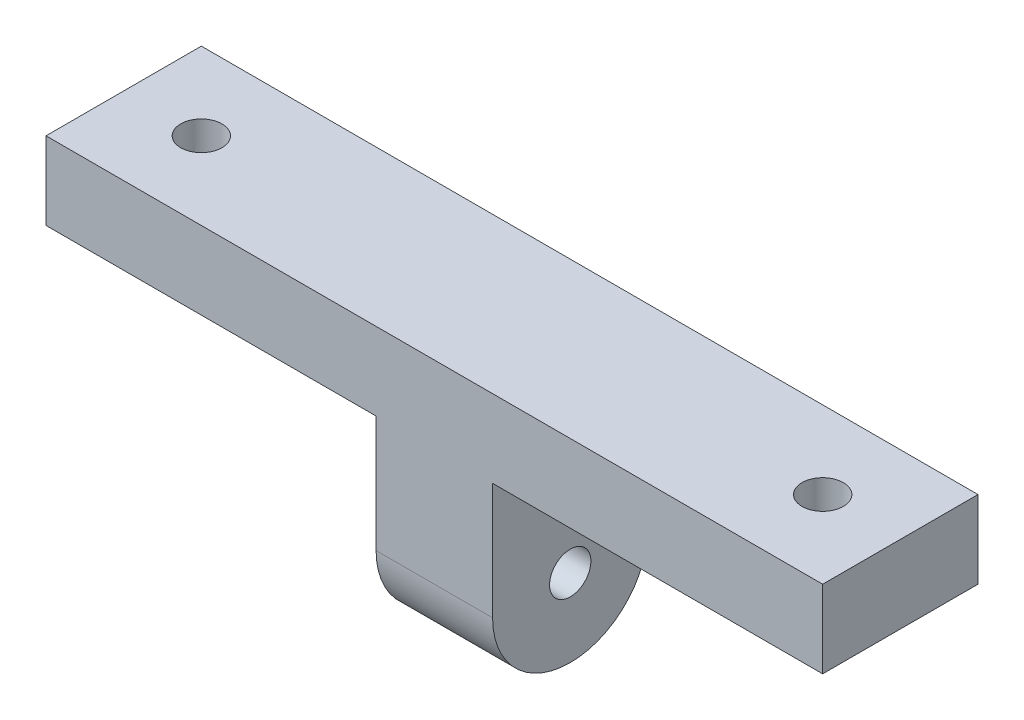
ISO-10303-21;
HEADER;
FILE_DESCRIPTION(('STEP AP214'),'2;1');
FILE_NAME('part.step','',(''),(''),'','','');
FILE_SCHEMA(('AUTOMOTIVE_DESIGN { 1 0 10303 214 1 1 1 1 }'));
ENDSEC;
DATA;
#1=APPLICATION_CONTEXT('core data for automotive mechanical design processes');
#2=APPLICATION_PROTOCOL_DEFINITION('international standard','automotive_design',2000,#1);
#3=PRODUCT_CONTEXT('',#1,'mechanical');
#4=PRODUCT('Part','Part','',(#3));
#5=PRODUCT_RELATED_PRODUCT_CATEGORY('part','',(#4));
#6=PRODUCT_DEFINITION_FORMATION('','',#4);
#7=PRODUCT_DEFINITION_CONTEXT('part definition',#1,'design');
#8=PRODUCT_DEFINITION('design','',#6,#7);
#9=PRODUCT_DEFINITION_SHAPE('','',#8);
#10=(LENGTH_UNIT() NAMED_UNIT(*) SI_UNIT(.MILLI.,.METRE.));
#11=(NAMED_UNIT(*) PLANE_ANGLE_UNIT() SI_UNIT($,.RADIAN.));
#12=(NAMED_UNIT(*) SI_UNIT($,.STERADIAN.) SOLID_ANGLE_UNIT());
#13=UNCERTAINTY_MEASURE_WITH_UNIT(LENGTH_MEASURE(1.E-05),#10,'distance_accuracy_value','');
#14=(GEOMETRIC_REPRESENTATION_CONTEXT(3) GLOBAL_UNCERTAINTY_ASSIGNED_CONTEXT((#13)) GLOBAL_UNIT_ASSIGNED_CONTEXT((#10,
#11,#12)) REPRESENTATION_CONTEXT('',''));
#15=CARTESIAN_POINT('',(0.,0.,0.));
#16=DIRECTION('',(0.,0.,1.));
#17=DIRECTION('',(1.,0.,0.));
#18=AXIS2_PLACEMENT_3D('',#15,#16,#17);
#19=CARTESIAN_POINT('',(0.,0.,0.));
#20=DIRECTION('',(0.,1.,0.));
#21=DIRECTION('',(0.,0.,1.));
#22=AXIS2_PLACEMENT_3D('',#19,#20,#21);
#23=PLANE('',#22);
#24=CARTESIAN_POINT('',(50.8,0.,0.));
#25=DIRECTION('',(0.,1.,0.));
#26=DIRECTION('',(0.,0.,1.));
#27=AXIS2_PLACEMENT_3D('',#24,#25,#26);
#28=CIRCLE('',#27,3.3782);
#29=CARTESIAN_POINT('',(50.8,0.,3.3782));
#30=VERTEX_POINT('',#29);
#31=EDGE_CURVE('E152',#30,#30,#28,.T.);
#32=ORIENTED_EDGE('',*,*,#31,.T.);
#33=EDGE_LOOP('',(#32));
#34=FACE_BOUND('',#33,.T.);
#35=DIRECTION('',(0.,0.,1.));
#36=VECTOR('',#35,1.);
#37=CARTESIAN_POINT('',(9.52500000000001,0.,0.));
#38=LINE('',#37,#36);
#39=CARTESIAN_POINT('',(9.52500000000001,0.,-12.7));
#40=VERTEX_POINT('',#39);
#41=CARTESIAN_POINT('',(9.52500000000001,0.,12.7));
#42=VERTEX_POINT('',#41);
#43=EDGE_CURVE('E114',#40,#42,#38,.T.);
#44=ORIENTED_EDGE('',*,*,#43,.F.);
#45=DIRECTION('',(1.,0.,0.));
#46=VECTOR('',#45,1.);
#47=CARTESIAN_POINT('',(0.,0.,-12.7));
#48=LINE('',#47,#46);
#49=CARTESIAN_POINT('',(63.5,0.,-12.7));
#50=VERTEX_POINT('',#49);
#51=EDGE_CURVE('E128',#40,#50,#48,.T.);
#52=ORIENTED_EDGE('',*,*,#51,.T.);
#53=DIRECTION('',(0.,0.,1.));
#54=VECTOR('',#53,1.);
#55=CARTESIAN_POINT('',(63.5,0.,0.));
#56=LINE('',#55,#54);
#57=CARTESIAN_POINT('',(63.5,0.,12.7));
#58=VERTEX_POINT('',#57);
#59=EDGE_CURVE('E140',#50,#58,#56,.T.);
#60=ORIENTED_EDGE('',*,*,#59,.T.);
#61=DIRECTION('',(1.,0.,0.));
#62=VECTOR('',#61,1.);
#63=CARTESIAN_POINT('',(0.,0.,12.7));
#64=LINE('',#63,#62);
#65=EDGE_CURVE('E130',#42,#58,#64,.T.);
#66=ORIENTED_EDGE('',*,*,#65,.F.);
#67=EDGE_LOOP('',(#44,#52,#60,#66));
#68=FACE_BOUND('',#67,.T.);
#69=ADVANCED_FACE('F41',(#34,#68),#23,.F.);
#70=CARTESIAN_POINT('',(0.,12.7,12.7));
#71=DIRECTION('',(0.,0.,-1.));
#72=DIRECTION('',(-1.,0.,0.));
#73=AXIS2_PLACEMENT_3D('',#70,#71,#72);
#74=PLANE('',#73);
#75=DIRECTION('',(0.,1.,0.));
#76=VECTOR('',#75,1.);
#77=CARTESIAN_POINT('',(-9.525,-31.75,12.7));
#78=LINE('',#77,#76);
#79=CARTESIAN_POINT('',(-9.525,-19.05,12.7));
#80=VERTEX_POINT('',#79);
#81=CARTESIAN_POINT('',(-9.525,0.,12.7));
#82=VERTEX_POINT('',#81);
#83=EDGE_CURVE('E240',#80,#82,#78,.T.);
#84=ORIENTED_EDGE('',*,*,#83,.F.);
#85=DIRECTION('',(1.,0.,0.));
#86=VECTOR('',#85,1.);
#87=CARTESIAN_POINT('',(0.,-19.05,12.7));
#88=LINE('',#87,#86);
#89=CARTESIAN_POINT('',(9.52500000000001,-19.05,12.7));
#90=VERTEX_POINT('',#89);
#91=EDGE_CURVE('E11',#80,#90,#88,.T.);
#92=ORIENTED_EDGE('',*,*,#91,.T.);
#93=DIRECTION('',(0.,1.,0.));
#94=VECTOR('',#93,1.);
#95=CARTESIAN_POINT('',(9.52500000000001,-31.75,12.7));
#96=LINE('',#95,#94);
#97=EDGE_CURVE('E208',#90,#42,#96,.T.);
#98=ORIENTED_EDGE('',*,*,#97,.T.);
#99=ORIENTED_EDGE('',*,*,#65,.T.);
#100=DIRECTION('',(0.,-1.,0.));
#101=VECTOR('',#100,1.);
#102=CARTESIAN_POINT('',(63.5,12.7,12.7));
#103=LINE('',#102,#101);
#104=CARTESIAN_POINT('',(63.5,12.7,12.7));
#105=VERTEX_POINT('',#104);
#106=EDGE_CURVE('E167',#105,#58,#103,.T.);
#107=ORIENTED_EDGE('',*,*,#106,.F.);
#108=DIRECTION('',(1.,0.,0.));
#109=VECTOR('',#108,1.);
#110=CARTESIAN_POINT('',(0.,12.7,12.7));
#111=LINE('',#110,#109);
#112=CARTESIAN_POINT('',(-63.5,12.7,12.7));
#113=VERTEX_POINT('',#112);
#114=EDGE_CURVE('E195',#113,#105,#111,.T.);
#115=ORIENTED_EDGE('',*,*,#114,.F.);
#116=DIRECTION('',(0.,-1.,0.));
#117=VECTOR('',#116,1.);
#118=CARTESIAN_POINT('',(-63.5,12.7,12.7));
#119=LINE('',#118,#117);
#120=CARTESIAN_POINT('',(-63.5,0.,12.7));
#121=VERTEX_POINT('',#120);
#122=EDGE_CURVE('E157',#113,#121,#119,.T.);
#123=ORIENTED_EDGE('',*,*,#122,.T.);
#124=EDGE_CURVE('E146',#121,#82,#64,.T.);
#125=ORIENTED_EDGE('',*,*,#124,.T.);
#126=EDGE_LOOP('',(#84,#92,#98,#99,#107,#115,#123,#125));
#127=FACE_BOUND('',#126,.T.);
#128=ADVANCED_FACE('F215',(#127),#74,.F.);
#129=CARTESIAN_POINT('',(63.5,12.7,0.));
#130=DIRECTION('',(1.,0.,0.));
#131=DIRECTION('',(0.,0.,-1.));
#132=AXIS2_PLACEMENT_3D('',#129,#130,#131);
#133=PLANE('',#132);
#134=ORIENTED_EDGE('',*,*,#59,.F.);
#135=DIRECTION('',(0.,-1.,0.));
#136=VECTOR('',#135,1.);
#137=CARTESIAN_POINT('',(63.5,12.7,-12.7));
#138=LINE('',#137,#136);
#139=CARTESIAN_POINT('',(63.5,12.7,-12.7));
#140=VERTEX_POINT('',#139);
#141=EDGE_CURVE('E136',#140,#50,#138,.T.);
#142=ORIENTED_EDGE('',*,*,#141,.F.);
#143=DIRECTION('',(0.,0.,1.));
#144=VECTOR('',#143,1.);
#145=CARTESIAN_POINT('',(63.5,12.7,0.));
#146=LINE('',#145,#144);
#147=EDGE_CURVE('E191',#140,#105,#146,.T.);
#148=ORIENTED_EDGE('',*,*,#147,.T.);
#149=ORIENTED_EDGE('',*,*,#106,.T.);
#150=EDGE_LOOP('',(#134,#142,#148,#149));
#151=FACE_BOUND('',#150,.T.);
#152=ADVANCED_FACE('F218',(#151),#133,.T.);
#153=CARTESIAN_POINT('',(0.,12.7,-12.7));
#154=DIRECTION('',(0.,0.,-1.));
#155=DIRECTION('',(-1.,0.,0.));
#156=AXIS2_PLACEMENT_3D('',#153,#154,#155);
#157=PLANE('',#156);
#158=DIRECTION('',(0.,1.,0.));
#159=VECTOR('',#158,1.);
#160=CARTESIAN_POINT('',(9.52500000000001,-31.75,-12.7));
#161=LINE('',#160,#159);
#162=CARTESIAN_POINT('',(9.52500000000001,-19.05,-12.7));
#163=VERTEX_POINT('',#162);
#164=EDGE_CURVE('E110',#163,#40,#161,.T.);
#165=ORIENTED_EDGE('',*,*,#164,.F.);
#166=DIRECTION('',(1.,0.,0.));
#167=VECTOR('',#166,1.);
#168=CARTESIAN_POINT('',(-9.525,-19.05,-12.7));
#169=LINE('',#168,#167);
#170=CARTESIAN_POINT('',(-9.525,-19.05,-12.7));
#171=VERTEX_POINT('',#170);
#172=EDGE_CURVE('E176',#163,#171,#169,.F.);
#173=ORIENTED_EDGE('',*,*,#172,.T.);
#174=DIRECTION('',(0.,1.,0.));
#175=VECTOR('',#174,1.);
#176=CARTESIAN_POINT('',(-9.525,-31.75,-12.7));
#177=LINE('',#176,#175);
#178=CARTESIAN_POINT('',(-9.525,0.,-12.7));
#179=VERTEX_POINT('',#178);
#180=EDGE_CURVE('E123',#171,#179,#177,.T.);
#181=ORIENTED_EDGE('',*,*,#180,.T.);
#182=CARTESIAN_POINT('',(-63.5,0.,-12.7));
#183=VERTEX_POINT('',#182);
#184=EDGE_CURVE('E139',#183,#179,#48,.T.);
#185=ORIENTED_EDGE('',*,*,#184,.F.);
#186=DIRECTION('',(0.,-1.,0.));
#187=VECTOR('',#186,1.);
#188=CARTESIAN_POINT('',(-63.5,12.7,-12.7));
#189=LINE('',#188,#187);
#190=CARTESIAN_POINT('',(-63.5,12.7,-12.7));
#191=VERTEX_POINT('',#190);
#192=EDGE_CURVE('E161',#191,#183,#189,.T.);
#193=ORIENTED_EDGE('',*,*,#192,.F.);
#194=DIRECTION('',(1.,0.,0.));
#195=VECTOR('',#194,1.);
#196=CARTESIAN_POINT('',(0.,12.7,-12.7));
#197=LINE('',#196,#195);
#198=EDGE_CURVE('E188',#191,#140,#197,.T.);
#199=ORIENTED_EDGE('',*,*,#198,.T.);
#200=ORIENTED_EDGE('',*,*,#141,.T.);
#201=ORIENTED_EDGE('',*,*,#51,.F.);
#202=EDGE_LOOP('',(#165,#173,#181,#185,#193,#199,#200,#201));
#203=FACE_BOUND('',#202,.T.);
#204=ADVANCED_FACE('F134',(#203),#157,.T.);
#205=CARTESIAN_POINT('',(-63.5,12.7,0.));
#206=DIRECTION('',(1.,0.,0.));
#207=DIRECTION('',(0.,0.,-1.));
#208=AXIS2_PLACEMENT_3D('',#205,#206,#207);
#209=PLANE('',#208);
#210=DIRECTION('',(0.,0.,1.));
#211=VECTOR('',#210,1.);
#212=CARTESIAN_POINT('',(-63.5,0.,0.));
#213=LINE('',#212,#211);
#214=EDGE_CURVE('E145',#183,#121,#213,.T.);
#215=ORIENTED_EDGE('',*,*,#214,.T.);
#216=ORIENTED_EDGE('',*,*,#122,.F.);
#217=DIRECTION('',(0.,0.,1.));
#218=VECTOR('',#217,1.);
#219=CARTESIAN_POINT('',(-63.5,12.7,0.));
#220=LINE('',#219,#218);
#221=EDGE_CURVE('E185',#191,#113,#220,.T.);
#222=ORIENTED_EDGE('',*,*,#221,.F.);
#223=ORIENTED_EDGE('',*,*,#192,.T.);
#224=EDGE_LOOP('',(#215,#216,#222,#223));
#225=FACE_BOUND('',#224,.T.);
#226=ADVANCED_FACE('F229',(#225),#209,.F.);
#227=CARTESIAN_POINT('',(-50.8,12.7,0.));
#228=DIRECTION('',(0.,-1.,0.));
#229=DIRECTION('',(0.,0.,-1.));
#230=AXIS2_PLACEMENT_3D('',#227,#228,#229);
#231=CYLINDRICAL_SURFACE('',#230,3.3782);
#232=CARTESIAN_POINT('',(-50.8,12.7,0.));
#233=DIRECTION('',(0.,1.,0.));
#234=DIRECTION('',(0.,0.,1.));
#235=AXIS2_PLACEMENT_3D('',#232,#233,#234);
#236=CIRCLE('',#235,3.3782);
#237=CARTESIAN_POINT('',(-50.8,12.7,3.3782));
#238=VERTEX_POINT('',#237);
#239=EDGE_CURVE('E156',#238,#238,#236,.T.);
#240=ORIENTED_EDGE('',*,*,#239,.T.);
#241=EDGE_LOOP('',(#240));
#242=FACE_BOUND('',#241,.T.);
#243=CARTESIAN_POINT('',(-50.8,0.,0.));
#244=DIRECTION('',(0.,1.,0.));
#245=DIRECTION('',(0.,0.,1.));
#246=AXIS2_PLACEMENT_3D('',#243,#244,#245);
#247=CIRCLE('',#246,3.3782);
#248=CARTESIAN_POINT('',(-50.8,0.,3.3782));
#249=VERTEX_POINT('',#248);
#250=EDGE_CURVE('E205',#249,#249,#247,.T.);
#251=ORIENTED_EDGE('',*,*,#250,.F.);
#252=EDGE_LOOP('',(#251));
#253=FACE_BOUND('',#252,.T.);
#254=ADVANCED_FACE('F275',(#242,#253),#231,.F.);
#255=CARTESIAN_POINT('',(50.8,12.7,0.));
#256=DIRECTION('',(0.,-1.,0.));
#257=DIRECTION('',(0.,0.,-1.));
#258=AXIS2_PLACEMENT_3D('',#255,#256,#257);
#259=CYLINDRICAL_SURFACE('',#258,3.3782);
#260=CARTESIAN_POINT('',(50.8,12.7,0.));
#261=DIRECTION('',(0.,1.,0.));
#262=DIRECTION('',(0.,0.,1.));
#263=AXIS2_PLACEMENT_3D('',#260,#261,#262);
#264=CIRCLE('',#263,3.3782);
#265=CARTESIAN_POINT('',(50.8,12.7,3.3782));
#266=VERTEX_POINT('',#265);
#267=EDGE_CURVE('E162',#266,#266,#264,.T.);
#268=ORIENTED_EDGE('',*,*,#267,.T.);
#269=EDGE_LOOP('',(#268));
#270=FACE_BOUND('',#269,.T.);
#271=ORIENTED_EDGE('',*,*,#31,.F.);
#272=EDGE_LOOP('',(#271));
#273=FACE_BOUND('',#272,.T.);
#274=ADVANCED_FACE('F271',(#270,#273),#259,.F.);
#275=CARTESIAN_POINT('',(0.,12.7,0.));
#276=DIRECTION('',(0.,1.,0.));
#277=DIRECTION('',(0.,0.,1.));
#278=AXIS2_PLACEMENT_3D('',#275,#276,#277);
#279=PLANE('',#278);
#280=ORIENTED_EDGE('',*,*,#239,.F.);
#281=EDGE_LOOP('',(#280));
#282=FACE_BOUND('',#281,.T.);
#283=ORIENTED_EDGE('',*,*,#114,.T.);
#284=ORIENTED_EDGE('',*,*,#147,.F.);
#285=ORIENTED_EDGE('',*,*,#198,.F.);
#286=ORIENTED_EDGE('',*,*,#221,.T.);
#287=EDGE_LOOP('',(#283,#284,#285,#286));
#288=FACE_BOUND('',#287,.T.);
#289=ORIENTED_EDGE('',*,*,#267,.F.);
#290=EDGE_LOOP('',(#289));
#291=FACE_BOUND('',#290,.T.);
#292=ADVANCED_FACE('F222',(#282,#288,#291),#279,.T.);
#293=ORIENTED_EDGE('',*,*,#250,.T.);
#294=EDGE_LOOP('',(#293));
#295=FACE_BOUND('',#294,.T.);
#296=ORIENTED_EDGE('',*,*,#184,.T.);
#297=DIRECTION('',(0.,0.,1.));
#298=VECTOR('',#297,1.);
#299=CARTESIAN_POINT('',(-9.525,0.,0.));
#300=LINE('',#299,#298);
#301=EDGE_CURVE('E124',#179,#82,#300,.T.);
#302=ORIENTED_EDGE('',*,*,#301,.T.);
#303=ORIENTED_EDGE('',*,*,#124,.F.);
#304=ORIENTED_EDGE('',*,*,#214,.F.);
#305=EDGE_LOOP('',(#296,#302,#303,#304));
#306=FACE_BOUND('',#305,.T.);
#307=ADVANCED_FACE('F232',(#295,#306),#23,.F.);
#308=CARTESIAN_POINT('',(9.52500000000001,-31.75,0.));
#309=DIRECTION('',(-1.,0.,0.));
#310=DIRECTION('',(0.,0.,1.));
#311=AXIS2_PLACEMENT_3D('',#308,#309,#310);
#312=PLANE('',#311);
#313=CARTESIAN_POINT('',(9.52500000000001,-19.05,0.));
#314=DIRECTION('',(-1.,0.,0.));
#315=DIRECTION('',(0.,0.,1.));
#316=AXIS2_PLACEMENT_3D('',#313,#314,#315);
#317=CIRCLE('',#316,3.3782);
#318=CARTESIAN_POINT('',(9.52500000000001,-19.05,3.3782));
#319=VERTEX_POINT('',#318);
#320=EDGE_CURVE('E132',#319,#319,#317,.T.);
#321=ORIENTED_EDGE('',*,*,#320,.T.);
#322=EDGE_LOOP('',(#321));
#323=FACE_BOUND('',#322,.T.);
#324=CARTESIAN_POINT('',(9.52500000000001,-19.05,0.));
#325=DIRECTION('',(-1.,0.,0.));
#326=DIRECTION('',(0.,0.,1.));
#327=AXIS2_PLACEMENT_3D('',#324,#325,#326);
#328=CIRCLE('',#327,12.7);
#329=CARTESIAN_POINT('',(9.52500000000001,-31.75,0.));
#330=VERTEX_POINT('',#329);
#331=EDGE_CURVE('E171',#90,#330,#328,.F.);
#332=ORIENTED_EDGE('',*,*,#331,.T.);
#333=CARTESIAN_POINT('',(9.52500000000001,-19.05,0.));
#334=DIRECTION('',(-1.,0.,0.));
#335=DIRECTION('',(0.,0.,1.));
#336=AXIS2_PLACEMENT_3D('',#333,#334,#335);
#337=CIRCLE('',#336,12.7);
#338=EDGE_CURVE('E117',#330,#163,#337,.F.);
#339=ORIENTED_EDGE('',*,*,#338,.T.);
#340=ORIENTED_EDGE('',*,*,#164,.T.);
#341=ORIENTED_EDGE('',*,*,#43,.T.);
#342=ORIENTED_EDGE('',*,*,#97,.F.);
#343=EDGE_LOOP('',(#332,#339,#340,#341,#342));
#344=FACE_BOUND('',#343,.T.);
#345=ADVANCED_FACE('F112',(#323,#344),#312,.F.);
#346=CARTESIAN_POINT('',(-9.525,-31.75,0.));
#347=DIRECTION('',(-1.,0.,0.));
#348=DIRECTION('',(0.,0.,1.));
#349=AXIS2_PLACEMENT_3D('',#346,#347,#348);
#350=PLANE('',#349);
#351=CARTESIAN_POINT('',(-9.525,-19.05,0.));
#352=DIRECTION('',(-1.,0.,0.));
#353=DIRECTION('',(0.,0.,1.));
#354=AXIS2_PLACEMENT_3D('',#351,#352,#353);
#355=CIRCLE('',#354,3.3782);
#356=CARTESIAN_POINT('',(-9.525,-19.05,3.3782));
#357=VERTEX_POINT('',#356);
#358=EDGE_CURVE('E296',#357,#357,#355,.T.);
#359=ORIENTED_EDGE('',*,*,#358,.F.);
#360=EDGE_LOOP('',(#359));
#361=FACE_BOUND('',#360,.T.);
#362=ORIENTED_EDGE('',*,*,#180,.F.);
#363=CARTESIAN_POINT('',(-9.525,-19.05,0.));
#364=DIRECTION('',(-1.,0.,0.));
#365=DIRECTION('',(0.,0.,1.));
#366=AXIS2_PLACEMENT_3D('',#363,#364,#365);
#367=CIRCLE('',#366,12.7);
#368=CARTESIAN_POINT('',(-9.525,-31.75,0.));
#369=VERTEX_POINT('',#368);
#370=EDGE_CURVE('E51',#171,#369,#367,.T.);
#371=ORIENTED_EDGE('',*,*,#370,.T.);
#372=CARTESIAN_POINT('',(-9.525,-19.05,0.));
#373=DIRECTION('',(-1.,0.,0.));
#374=DIRECTION('',(0.,0.,1.));
#375=AXIS2_PLACEMENT_3D('',#372,#373,#374);
#376=CIRCLE('',#375,12.7);
#377=EDGE_CURVE('E58',#369,#80,#376,.T.);
#378=ORIENTED_EDGE('',*,*,#377,.T.);
#379=ORIENTED_EDGE('',*,*,#83,.T.);
#380=ORIENTED_EDGE('',*,*,#301,.F.);
#381=EDGE_LOOP('',(#362,#371,#378,#379,#380));
#382=FACE_BOUND('',#381,.T.);
#383=ADVANCED_FACE('F243',(#361,#382),#350,.T.);
#384=CARTESIAN_POINT('',(63.5,-19.05,0.));
#385=DIRECTION('',(-1.,0.,0.));
#386=DIRECTION('',(0.,0.,1.));
#387=AXIS2_PLACEMENT_3D('',#384,#385,#386);
#388=CYLINDRICAL_SURFACE('',#387,3.3782);
#389=ORIENTED_EDGE('',*,*,#358,.T.);
#390=EDGE_LOOP('',(#389));
#391=FACE_BOUND('',#390,.T.);
#392=ORIENTED_EDGE('',*,*,#320,.F.);
#393=EDGE_LOOP('',(#392));
#394=FACE_BOUND('',#393,.T.);
#395=ADVANCED_FACE('F245',(#391,#394),#388,.F.);
#396=CARTESIAN_POINT('',(0.,-19.05,0.));
#397=DIRECTION('',(1.,0.,0.));
#398=DIRECTION('',(0.,0.,-1.));
#399=AXIS2_PLACEMENT_3D('',#396,#397,#398);
#400=CYLINDRICAL_SURFACE('',#399,12.7);
#401=ORIENTED_EDGE('',*,*,#91,.F.);
#402=ORIENTED_EDGE('',*,*,#377,.F.);
#403=DIRECTION('',(1.,0.,0.));
#404=VECTOR('',#403,1.);
#405=CARTESIAN_POINT('',(0.,-31.75,0.));
#406=LINE('',#405,#404);
#407=EDGE_CURVE('E45',#330,#369,#406,.F.);
#408=ORIENTED_EDGE('',*,*,#407,.F.);
#409=ORIENTED_EDGE('',*,*,#331,.F.);
#410=EDGE_LOOP('',(#401,#402,#408,#409));
#411=FACE_BOUND('',#410,.T.);
#412=ADVANCED_FACE('F43',(#411),#400,.T.);
#413=CARTESIAN_POINT('',(0.,-19.05,0.));
#414=DIRECTION('',(-1.,0.,0.));
#415=DIRECTION('',(0.,0.,1.));
#416=AXIS2_PLACEMENT_3D('',#413,#414,#415);
#417=CYLINDRICAL_SURFACE('',#416,12.7);
#418=ORIENTED_EDGE('',*,*,#370,.F.);
#419=ORIENTED_EDGE('',*,*,#172,.F.);
#420=ORIENTED_EDGE('',*,*,#338,.F.);
#421=ORIENTED_EDGE('',*,*,#407,.T.);
#422=EDGE_LOOP('',(#418,#419,#420,#421));
#423=FACE_BOUND('',#422,.T.);
#424=ADVANCED_FACE('F285',(#423),#417,.T.);
#425=CLOSED_SHELL('',(#69,#128,#152,#204,#226,#254,#274,#292,#307,#345,#383,#395,#412,#424));
#426=MANIFOLD_SOLID_BREP('B2',#425);
#427=ADVANCED_BREP_SHAPE_REPRESENTATION('',(#18,#426),#14);
#428=SHAPE_DEFINITION_REPRESENTATION(#9,#427);
ENDSEC;
END-ISO-10303-21;
